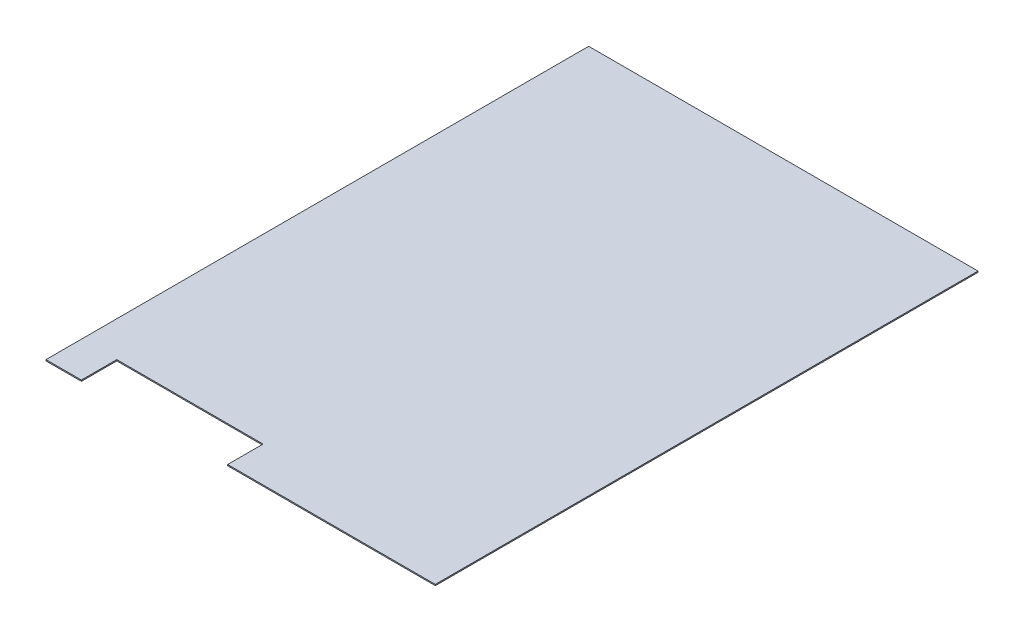
ISO-10303-21;
HEADER;
FILE_DESCRIPTION(('STEP AP214'),'2;1');
FILE_NAME('part.step','',(''),(''),'','','');
FILE_SCHEMA(('AUTOMOTIVE_DESIGN { 1 0 10303 214 1 1 1 1 }'));
ENDSEC;
DATA;
#1=APPLICATION_CONTEXT('core data for automotive mechanical design processes');
#2=APPLICATION_PROTOCOL_DEFINITION('international standard','automotive_design',2000,#1);
#3=PRODUCT_CONTEXT('',#1,'mechanical');
#4=PRODUCT('Part','Part','',(#3));
#5=PRODUCT_RELATED_PRODUCT_CATEGORY('part','',(#4));
#6=PRODUCT_DEFINITION_FORMATION('','',#4);
#7=PRODUCT_DEFINITION_CONTEXT('part definition',#1,'design');
#8=PRODUCT_DEFINITION('design','',#6,#7);
#9=PRODUCT_DEFINITION_SHAPE('','',#8);
#10=(LENGTH_UNIT() NAMED_UNIT(*) SI_UNIT(.MILLI.,.METRE.));
#11=(NAMED_UNIT(*) PLANE_ANGLE_UNIT() SI_UNIT($,.RADIAN.));
#12=(NAMED_UNIT(*) SI_UNIT($,.STERADIAN.) SOLID_ANGLE_UNIT());
#13=UNCERTAINTY_MEASURE_WITH_UNIT(LENGTH_MEASURE(1.E-05),#10,'distance_accuracy_value','');
#14=(GEOMETRIC_REPRESENTATION_CONTEXT(3) GLOBAL_UNCERTAINTY_ASSIGNED_CONTEXT((#13)) GLOBAL_UNIT_ASSIGNED_CONTEXT((#10,
#11,#12)) REPRESENTATION_CONTEXT('',''));
#15=CARTESIAN_POINT('',(0.,0.,0.));
#16=DIRECTION('',(0.,0.,1.));
#17=DIRECTION('',(1.,0.,0.));
#18=AXIS2_PLACEMENT_3D('',#15,#16,#17);
#19=CARTESIAN_POINT('',(-82.5,0.5,115.));
#20=DIRECTION('',(0.,0.,-1.));
#21=DIRECTION('',(-1.,0.,0.));
#22=AXIS2_PLACEMENT_3D('',#19,#20,#21);
#23=PLANE('',#22);
#24=DIRECTION('',(1.,0.,0.));
#25=VECTOR('',#24,1.);
#26=CARTESIAN_POINT('',(-82.5,0.,115.));
#27=LINE('',#26,#25);
#28=CARTESIAN_POINT('',(-82.5,0.,115.));
#29=VERTEX_POINT('',#28);
#30=CARTESIAN_POINT('',(-67.5,0.,115.));
#31=VERTEX_POINT('',#30);
#32=EDGE_CURVE('E138',#29,#31,#27,.T.);
#33=ORIENTED_EDGE('',*,*,#32,.T.);
#34=DIRECTION('',(0.,1.,0.));
#35=VECTOR('',#34,1.);
#36=CARTESIAN_POINT('',(-67.5,-9.5,115.));
#37=LINE('',#36,#35);
#38=CARTESIAN_POINT('',(-67.5,0.5,115.));
#39=VERTEX_POINT('',#38);
#40=EDGE_CURVE('E134',#31,#39,#37,.T.);
#41=ORIENTED_EDGE('',*,*,#40,.T.);
#42=DIRECTION('',(1.,0.,0.));
#43=VECTOR('',#42,1.);
#44=CARTESIAN_POINT('',(-82.5,0.5,115.));
#45=LINE('',#44,#43);
#46=CARTESIAN_POINT('',(-82.5,0.5,115.));
#47=VERTEX_POINT('',#46);
#48=EDGE_CURVE('E123',#47,#39,#45,.T.);
#49=ORIENTED_EDGE('',*,*,#48,.F.);
#50=DIRECTION('',(0.,-1.,0.));
#51=VECTOR('',#50,1.);
#52=CARTESIAN_POINT('',(-82.5,0.5,115.));
#53=LINE('',#52,#51);
#54=EDGE_CURVE('E143',#47,#29,#53,.T.);
#55=ORIENTED_EDGE('',*,*,#54,.T.);
#56=EDGE_LOOP('',(#33,#41,#49,#55));
#57=FACE_BOUND('',#56,.T.);
#58=ADVANCED_FACE('F34',(#57),#23,.F.);
#59=CARTESIAN_POINT('',(82.5,0.5,-115.));
#60=DIRECTION('',(-1.,0.,0.));
#61=DIRECTION('',(0.,0.,1.));
#62=AXIS2_PLACEMENT_3D('',#59,#60,#61);
#63=PLANE('',#62);
#64=DIRECTION('',(0.,0.,-1.));
#65=VECTOR('',#64,1.);
#66=CARTESIAN_POINT('',(82.5,0.,-115.));
#67=LINE('',#66,#65);
#68=CARTESIAN_POINT('',(82.5,0.,115.));
#69=VERTEX_POINT('',#68);
#70=CARTESIAN_POINT('',(82.5,0.,-115.));
#71=VERTEX_POINT('',#70);
#72=EDGE_CURVE('E130',#69,#71,#67,.T.);
#73=ORIENTED_EDGE('',*,*,#72,.T.);
#74=DIRECTION('',(0.,-1.,0.));
#75=VECTOR('',#74,1.);
#76=CARTESIAN_POINT('',(82.5,0.5,-115.));
#77=LINE('',#76,#75);
#78=CARTESIAN_POINT('',(82.5,0.5,-115.));
#79=VERTEX_POINT('',#78);
#80=EDGE_CURVE('E149',#79,#71,#77,.T.);
#81=ORIENTED_EDGE('',*,*,#80,.F.);
#82=DIRECTION('',(0.,0.,-1.));
#83=VECTOR('',#82,1.);
#84=CARTESIAN_POINT('',(82.5,0.5,-115.));
#85=LINE('',#84,#83);
#86=CARTESIAN_POINT('',(82.5,0.5,115.));
#87=VERTEX_POINT('',#86);
#88=EDGE_CURVE('E141',#87,#79,#85,.T.);
#89=ORIENTED_EDGE('',*,*,#88,.F.);
#90=DIRECTION('',(0.,-1.,0.));
#91=VECTOR('',#90,1.);
#92=CARTESIAN_POINT('',(82.5,0.5,115.));
#93=LINE('',#92,#91);
#94=EDGE_CURVE('E121',#87,#69,#93,.T.);
#95=ORIENTED_EDGE('',*,*,#94,.T.);
#96=EDGE_LOOP('',(#73,#81,#89,#95));
#97=FACE_BOUND('',#96,.T.);
#98=ADVANCED_FACE('F36',(#97),#63,.F.);
#99=CARTESIAN_POINT('',(-82.5,0.5,-115.));
#100=DIRECTION('',(0.,0.,1.));
#101=DIRECTION('',(1.,0.,0.));
#102=AXIS2_PLACEMENT_3D('',#99,#100,#101);
#103=PLANE('',#102);
#104=DIRECTION('',(-1.,0.,0.));
#105=VECTOR('',#104,1.);
#106=CARTESIAN_POINT('',(-82.5,0.,-115.));
#107=LINE('',#106,#105);
#108=CARTESIAN_POINT('',(-82.5,0.,-115.));
#109=VERTEX_POINT('',#108);
#110=EDGE_CURVE('E133',#71,#109,#107,.T.);
#111=ORIENTED_EDGE('',*,*,#110,.T.);
#112=DIRECTION('',(0.,-1.,0.));
#113=VECTOR('',#112,1.);
#114=CARTESIAN_POINT('',(-82.5,0.5,-115.));
#115=LINE('',#114,#113);
#116=CARTESIAN_POINT('',(-82.5,0.5,-115.));
#117=VERTEX_POINT('',#116);
#118=EDGE_CURVE('E146',#117,#109,#115,.T.);
#119=ORIENTED_EDGE('',*,*,#118,.F.);
#120=DIRECTION('',(-1.,0.,0.));
#121=VECTOR('',#120,1.);
#122=CARTESIAN_POINT('',(-82.5,0.5,-115.));
#123=LINE('',#122,#121);
#124=EDGE_CURVE('E88',#79,#117,#123,.T.);
#125=ORIENTED_EDGE('',*,*,#124,.F.);
#126=ORIENTED_EDGE('',*,*,#80,.T.);
#127=EDGE_LOOP('',(#111,#119,#125,#126));
#128=FACE_BOUND('',#127,.T.);
#129=ADVANCED_FACE('F169',(#128),#103,.F.);
#130=CARTESIAN_POINT('',(-82.5,0.5,-115.));
#131=DIRECTION('',(1.,0.,0.));
#132=DIRECTION('',(0.,0.,-1.));
#133=AXIS2_PLACEMENT_3D('',#130,#131,#132);
#134=PLANE('',#133);
#135=DIRECTION('',(0.,0.,1.));
#136=VECTOR('',#135,1.);
#137=CARTESIAN_POINT('',(-82.5,0.,-115.));
#138=LINE('',#137,#136);
#139=EDGE_CURVE('E136',#109,#29,#138,.T.);
#140=ORIENTED_EDGE('',*,*,#139,.T.);
#141=ORIENTED_EDGE('',*,*,#54,.F.);
#142=DIRECTION('',(0.,0.,1.));
#143=VECTOR('',#142,1.);
#144=CARTESIAN_POINT('',(-82.5,0.5,-115.));
#145=LINE('',#144,#143);
#146=EDGE_CURVE('E124',#117,#47,#145,.T.);
#147=ORIENTED_EDGE('',*,*,#146,.F.);
#148=ORIENTED_EDGE('',*,*,#118,.T.);
#149=EDGE_LOOP('',(#140,#141,#147,#148));
#150=FACE_BOUND('',#149,.T.);
#151=ADVANCED_FACE('F172',(#150),#134,.F.);
#152=CARTESIAN_POINT('',(-5.50000000000002,0.5,115.));
#153=VERTEX_POINT('',#152);
#154=EDGE_CURVE('E58',#153,#87,#45,.T.);
#155=ORIENTED_EDGE('',*,*,#154,.F.);
#156=DIRECTION('',(0.,1.,0.));
#157=VECTOR('',#156,1.);
#158=CARTESIAN_POINT('',(-5.50000000000002,-9.5,115.));
#159=LINE('',#158,#157);
#160=CARTESIAN_POINT('',(-5.50000000000002,0.,115.));
#161=VERTEX_POINT('',#160);
#162=EDGE_CURVE('E107',#161,#153,#159,.T.);
#163=ORIENTED_EDGE('',*,*,#162,.F.);
#164=EDGE_CURVE('E80',#161,#69,#27,.T.);
#165=ORIENTED_EDGE('',*,*,#164,.T.);
#166=ORIENTED_EDGE('',*,*,#94,.F.);
#167=EDGE_LOOP('',(#155,#163,#165,#166));
#168=FACE_BOUND('',#167,.T.);
#169=ADVANCED_FACE('F120',(#168),#23,.F.);
#170=CARTESIAN_POINT('',(0.,0.5,0.));
#171=DIRECTION('',(0.,1.,0.));
#172=DIRECTION('',(0.,0.,1.));
#173=AXIS2_PLACEMENT_3D('',#170,#171,#172);
#174=PLANE('',#173);
#175=DIRECTION('',(0.,0.,1.));
#176=VECTOR('',#175,1.);
#177=CARTESIAN_POINT('',(-67.5,0.5,115.));
#178=LINE('',#177,#176);
#179=CARTESIAN_POINT('',(-67.5,0.5,100.));
#180=VERTEX_POINT('',#179);
#181=EDGE_CURVE('E113',#180,#39,#178,.T.);
#182=ORIENTED_EDGE('',*,*,#181,.F.);
#183=DIRECTION('',(-1.,0.,0.));
#184=VECTOR('',#183,1.);
#185=CARTESIAN_POINT('',(-67.5,0.5,100.));
#186=LINE('',#185,#184);
#187=CARTESIAN_POINT('',(-5.50000000000002,0.5,100.));
#188=VERTEX_POINT('',#187);
#189=EDGE_CURVE('E118',#188,#180,#186,.T.);
#190=ORIENTED_EDGE('',*,*,#189,.F.);
#191=DIRECTION('',(0.,0.,-1.));
#192=VECTOR('',#191,1.);
#193=CARTESIAN_POINT('',(-5.50000000000002,0.5,100.));
#194=LINE('',#193,#192);
#195=EDGE_CURVE('E109',#153,#188,#194,.T.);
#196=ORIENTED_EDGE('',*,*,#195,.F.);
#197=ORIENTED_EDGE('',*,*,#154,.T.);
#198=ORIENTED_EDGE('',*,*,#88,.T.);
#199=ORIENTED_EDGE('',*,*,#124,.T.);
#200=ORIENTED_EDGE('',*,*,#146,.T.);
#201=ORIENTED_EDGE('',*,*,#48,.T.);
#202=EDGE_LOOP('',(#182,#190,#196,#197,#198,#199,#200,#201));
#203=FACE_BOUND('',#202,.T.);
#204=ADVANCED_FACE('F116',(#203),#174,.T.);
#205=CARTESIAN_POINT('',(0.,0.,0.));
#206=DIRECTION('',(0.,1.,0.));
#207=DIRECTION('',(0.,0.,1.));
#208=AXIS2_PLACEMENT_3D('',#205,#206,#207);
#209=PLANE('',#208);
#210=DIRECTION('',(-1.,0.,0.));
#211=VECTOR('',#210,1.);
#212=CARTESIAN_POINT('',(0.,0.,100.));
#213=LINE('',#212,#211);
#214=CARTESIAN_POINT('',(-5.50000000000002,0.,100.));
#215=VERTEX_POINT('',#214);
#216=CARTESIAN_POINT('',(-67.5,0.,100.));
#217=VERTEX_POINT('',#216);
#218=EDGE_CURVE('E42',#215,#217,#213,.T.);
#219=ORIENTED_EDGE('',*,*,#218,.T.);
#220=DIRECTION('',(0.,0.,1.));
#221=VECTOR('',#220,1.);
#222=CARTESIAN_POINT('',(-67.5,0.,0.));
#223=LINE('',#222,#221);
#224=EDGE_CURVE('E11',#217,#31,#223,.T.);
#225=ORIENTED_EDGE('',*,*,#224,.T.);
#226=ORIENTED_EDGE('',*,*,#32,.F.);
#227=ORIENTED_EDGE('',*,*,#139,.F.);
#228=ORIENTED_EDGE('',*,*,#110,.F.);
#229=ORIENTED_EDGE('',*,*,#72,.F.);
#230=ORIENTED_EDGE('',*,*,#164,.F.);
#231=DIRECTION('',(0.,0.,-1.));
#232=VECTOR('',#231,1.);
#233=CARTESIAN_POINT('',(-5.50000000000003,0.,0.));
#234=LINE('',#233,#232);
#235=EDGE_CURVE('E112',#161,#215,#234,.T.);
#236=ORIENTED_EDGE('',*,*,#235,.T.);
#237=EDGE_LOOP('',(#219,#225,#226,#227,#228,#229,#230,#236));
#238=FACE_BOUND('',#237,.T.);
#239=ADVANCED_FACE('F153',(#238),#209,.F.);
#240=CARTESIAN_POINT('',(-67.5,-9.5,115.));
#241=DIRECTION('',(-1.,0.,0.));
#242=DIRECTION('',(0.,0.,1.));
#243=AXIS2_PLACEMENT_3D('',#240,#241,#242);
#244=PLANE('',#243);
#245=DIRECTION('',(0.,1.,0.));
#246=VECTOR('',#245,1.);
#247=CARTESIAN_POINT('',(-67.5,-9.5,100.));
#248=LINE('',#247,#246);
#249=EDGE_CURVE('E158',#217,#180,#248,.T.);
#250=ORIENTED_EDGE('',*,*,#249,.T.);
#251=ORIENTED_EDGE('',*,*,#181,.T.);
#252=ORIENTED_EDGE('',*,*,#40,.F.);
#253=ORIENTED_EDGE('',*,*,#224,.F.);
#254=EDGE_LOOP('',(#250,#251,#252,#253));
#255=FACE_BOUND('',#254,.T.);
#256=ADVANCED_FACE('F176',(#255),#244,.F.);
#257=CARTESIAN_POINT('',(-67.5,-9.5,100.));
#258=DIRECTION('',(0.,0.,-1.));
#259=DIRECTION('',(-1.,0.,0.));
#260=AXIS2_PLACEMENT_3D('',#257,#258,#259);
#261=PLANE('',#260);
#262=DIRECTION('',(0.,1.,0.));
#263=VECTOR('',#262,1.);
#264=CARTESIAN_POINT('',(-5.50000000000002,-9.5,100.));
#265=LINE('',#264,#263);
#266=EDGE_CURVE('E49',#215,#188,#265,.T.);
#267=ORIENTED_EDGE('',*,*,#266,.T.);
#268=ORIENTED_EDGE('',*,*,#189,.T.);
#269=ORIENTED_EDGE('',*,*,#249,.F.);
#270=ORIENTED_EDGE('',*,*,#218,.F.);
#271=EDGE_LOOP('',(#267,#268,#269,#270));
#272=FACE_BOUND('',#271,.T.);
#273=ADVANCED_FACE('F157',(#272),#261,.F.);
#274=CARTESIAN_POINT('',(-5.50000000000002,-9.5,100.));
#275=DIRECTION('',(1.,0.,0.));
#276=DIRECTION('',(0.,0.,-1.));
#277=AXIS2_PLACEMENT_3D('',#274,#275,#276);
#278=PLANE('',#277);
#279=ORIENTED_EDGE('',*,*,#162,.T.);
#280=ORIENTED_EDGE('',*,*,#195,.T.);
#281=ORIENTED_EDGE('',*,*,#266,.F.);
#282=ORIENTED_EDGE('',*,*,#235,.F.);
#283=EDGE_LOOP('',(#279,#280,#281,#282));
#284=FACE_BOUND('',#283,.T.);
#285=ADVANCED_FACE('F108',(#284),#278,.F.);
#286=CLOSED_SHELL('',(#58,#98,#129,#151,#169,#204,#239,#256,#273,#285));
#287=MANIFOLD_SOLID_BREP('B2',#286);
#288=ADVANCED_BREP_SHAPE_REPRESENTATION('',(#18,#287),#14);
#289=SHAPE_DEFINITION_REPRESENTATION(#9,#288);
ENDSEC;
END-ISO-10303-21;
